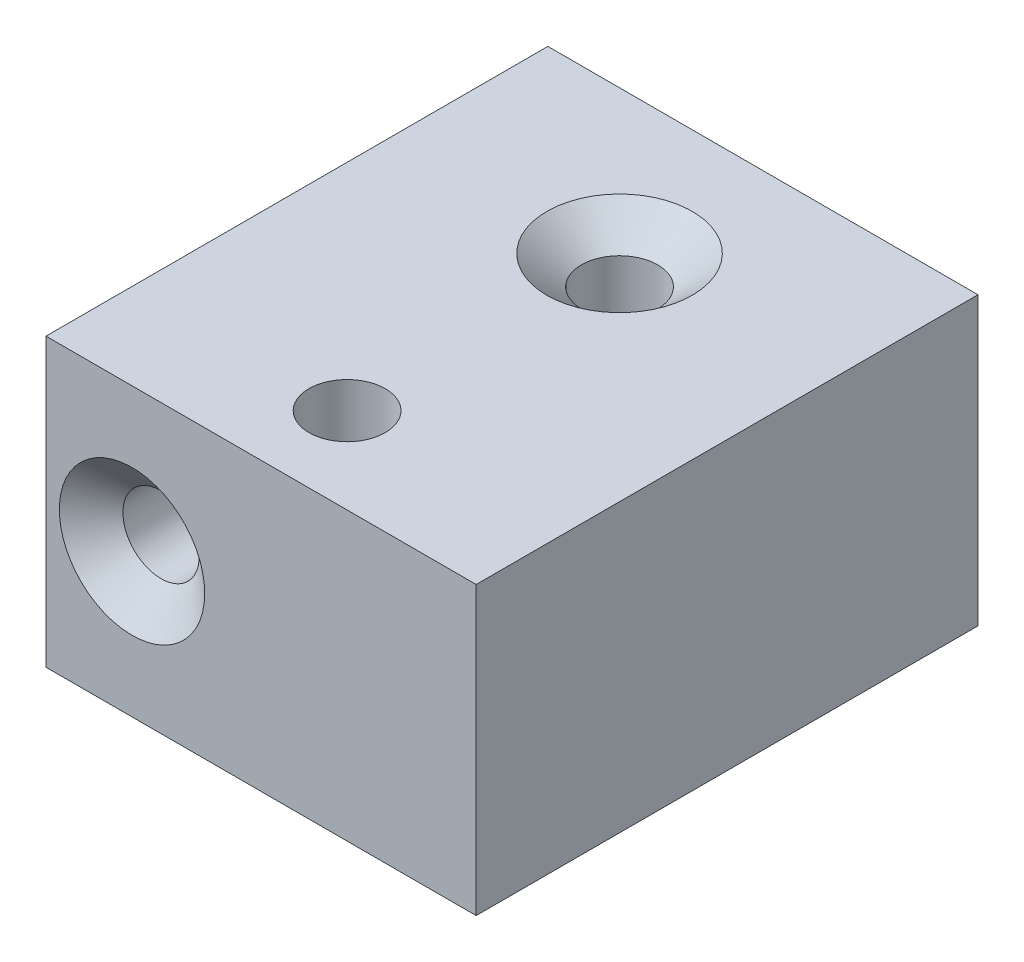
ISO-10303-21;
HEADER;
FILE_DESCRIPTION(('STEP AP214'),'2;1');
FILE_NAME('part.step','',(''),(''),'','','');
FILE_SCHEMA(('AUTOMOTIVE_DESIGN { 1 0 10303 214 1 1 1 1 }'));
ENDSEC;
DATA;
#1=APPLICATION_CONTEXT('core data for automotive mechanical design processes');
#2=APPLICATION_PROTOCOL_DEFINITION('international standard','automotive_design',2000,#1);
#3=PRODUCT_CONTEXT('',#1,'mechanical');
#4=PRODUCT('Part','Part','',(#3));
#5=PRODUCT_RELATED_PRODUCT_CATEGORY('part','',(#4));
#6=PRODUCT_DEFINITION_FORMATION('','',#4);
#7=PRODUCT_DEFINITION_CONTEXT('part definition',#1,'design');
#8=PRODUCT_DEFINITION('design','',#6,#7);
#9=PRODUCT_DEFINITION_SHAPE('','',#8);
#10=(LENGTH_UNIT() NAMED_UNIT(*) SI_UNIT(.MILLI.,.METRE.));
#11=(NAMED_UNIT(*) PLANE_ANGLE_UNIT() SI_UNIT($,.RADIAN.));
#12=(NAMED_UNIT(*) SI_UNIT($,.STERADIAN.) SOLID_ANGLE_UNIT());
#13=UNCERTAINTY_MEASURE_WITH_UNIT(LENGTH_MEASURE(1.E-05),#10,'distance_accuracy_value','');
#14=(GEOMETRIC_REPRESENTATION_CONTEXT(3) GLOBAL_UNCERTAINTY_ASSIGNED_CONTEXT((#13)) GLOBAL_UNIT_ASSIGNED_CONTEXT((#10,
#11,#12)) REPRESENTATION_CONTEXT('',''));
#15=CARTESIAN_POINT('',(0.,0.,0.));
#16=DIRECTION('',(0.,0.,1.));
#17=DIRECTION('',(1.,0.,0.));
#18=AXIS2_PLACEMENT_3D('',#15,#16,#17);
#19=CARTESIAN_POINT('',(19.05,25.4,22.225));
#20=DIRECTION('',(-1.,0.,0.));
#21=DIRECTION('',(0.,0.,1.));
#22=AXIS2_PLACEMENT_3D('',#19,#20,#21);
#23=PLANE('',#22);
#24=DIRECTION('',(0.,0.,-1.));
#25=VECTOR('',#24,1.);
#26=CARTESIAN_POINT('',(19.05,0.,22.225));
#27=LINE('',#26,#25);
#28=CARTESIAN_POINT('',(19.05,0.,22.225));
#29=VERTEX_POINT('',#28);
#30=CARTESIAN_POINT('',(19.05,0.,-22.225));
#31=VERTEX_POINT('',#30);
#32=EDGE_CURVE('E112',#29,#31,#27,.T.);
#33=ORIENTED_EDGE('',*,*,#32,.T.);
#34=DIRECTION('',(0.,-1.,0.));
#35=VECTOR('',#34,1.);
#36=CARTESIAN_POINT('',(19.05,25.4,-22.225));
#37=LINE('',#36,#35);
#38=CARTESIAN_POINT('',(19.05,25.4,-22.225));
#39=VERTEX_POINT('',#38);
#40=EDGE_CURVE('E11',#39,#31,#37,.T.);
#41=ORIENTED_EDGE('',*,*,#40,.F.);
#42=DIRECTION('',(0.,0.,-1.));
#43=VECTOR('',#42,1.);
#44=CARTESIAN_POINT('',(19.05,25.4,22.225));
#45=LINE('',#44,#43);
#46=CARTESIAN_POINT('',(19.05,25.4,22.225));
#47=VERTEX_POINT('',#46);
#48=EDGE_CURVE('E95',#47,#39,#45,.T.);
#49=ORIENTED_EDGE('',*,*,#48,.F.);
#50=DIRECTION('',(0.,-1.,0.));
#51=VECTOR('',#50,1.);
#52=CARTESIAN_POINT('',(19.05,25.4,22.225));
#53=LINE('',#52,#51);
#54=EDGE_CURVE('E108',#47,#29,#53,.T.);
#55=ORIENTED_EDGE('',*,*,#54,.T.);
#56=EDGE_LOOP('',(#33,#41,#49,#55));
#57=FACE_BOUND('',#56,.T.);
#58=ADVANCED_FACE('F43',(#57),#23,.F.);
#59=CARTESIAN_POINT('',(-19.05,25.4,-22.225));
#60=DIRECTION('',(0.,0.,1.));
#61=DIRECTION('',(1.,0.,0.));
#62=AXIS2_PLACEMENT_3D('',#59,#60,#61);
#63=PLANE('',#62);
#64=CARTESIAN_POINT('',(-11.43,12.7,-22.225));
#65=DIRECTION('',(0.,0.,1.));
#66=DIRECTION('',(1.,0.,0.));
#67=AXIS2_PLACEMENT_3D('',#64,#65,#66);
#68=CIRCLE('',#67,3.37819999999999);
#69=CARTESIAN_POINT('',(-8.05180000000001,12.7,-22.225));
#70=VERTEX_POINT('',#69);
#71=EDGE_CURVE('E156',#70,#70,#68,.T.);
#72=ORIENTED_EDGE('',*,*,#71,.T.);
#73=EDGE_LOOP('',(#72));
#74=FACE_BOUND('',#73,.T.);
#75=DIRECTION('',(-1.,0.,0.));
#76=VECTOR('',#75,1.);
#77=CARTESIAN_POINT('',(-19.05,0.,-22.225));
#78=LINE('',#77,#76);
#79=CARTESIAN_POINT('',(-19.05,0.,-22.225));
#80=VERTEX_POINT('',#79);
#81=EDGE_CURVE('E100',#31,#80,#78,.T.);
#82=ORIENTED_EDGE('',*,*,#81,.T.);
#83=DIRECTION('',(0.,-1.,0.));
#84=VECTOR('',#83,1.);
#85=CARTESIAN_POINT('',(-19.05,25.4,-22.225));
#86=LINE('',#85,#84);
#87=CARTESIAN_POINT('',(-19.05,25.4,-22.225));
#88=VERTEX_POINT('',#87);
#89=EDGE_CURVE('E52',#88,#80,#86,.T.);
#90=ORIENTED_EDGE('',*,*,#89,.F.);
#91=DIRECTION('',(-1.,0.,0.));
#92=VECTOR('',#91,1.);
#93=CARTESIAN_POINT('',(-19.05,25.4,-22.225));
#94=LINE('',#93,#92);
#95=EDGE_CURVE('E90',#39,#88,#94,.T.);
#96=ORIENTED_EDGE('',*,*,#95,.F.);
#97=ORIENTED_EDGE('',*,*,#40,.T.);
#98=EDGE_LOOP('',(#82,#90,#96,#97));
#99=FACE_BOUND('',#98,.T.);
#100=ADVANCED_FACE('F99',(#74,#99),#63,.F.);
#101=CARTESIAN_POINT('',(-19.05,25.4,22.225));
#102=DIRECTION('',(1.,0.,0.));
#103=DIRECTION('',(0.,0.,-1.));
#104=AXIS2_PLACEMENT_3D('',#101,#102,#103);
#105=PLANE('',#104);
#106=DIRECTION('',(0.,0.,1.));
#107=VECTOR('',#106,1.);
#108=CARTESIAN_POINT('',(-19.05,0.,22.225));
#109=LINE('',#108,#107);
#110=CARTESIAN_POINT('',(-19.05,0.,22.225));
#111=VERTEX_POINT('',#110);
#112=EDGE_CURVE('E77',#80,#111,#109,.T.);
#113=ORIENTED_EDGE('',*,*,#112,.T.);
#114=DIRECTION('',(0.,-1.,0.));
#115=VECTOR('',#114,1.);
#116=CARTESIAN_POINT('',(-19.05,25.4,22.225));
#117=LINE('',#116,#115);
#118=CARTESIAN_POINT('',(-19.05,25.4,22.225));
#119=VERTEX_POINT('',#118);
#120=EDGE_CURVE('E102',#119,#111,#117,.T.);
#121=ORIENTED_EDGE('',*,*,#120,.F.);
#122=DIRECTION('',(0.,0.,1.));
#123=VECTOR('',#122,1.);
#124=CARTESIAN_POINT('',(-19.05,25.4,22.225));
#125=LINE('',#124,#123);
#126=EDGE_CURVE('E93',#88,#119,#125,.T.);
#127=ORIENTED_EDGE('',*,*,#126,.F.);
#128=ORIENTED_EDGE('',*,*,#89,.T.);
#129=EDGE_LOOP('',(#113,#121,#127,#128));
#130=FACE_BOUND('',#129,.T.);
#131=ADVANCED_FACE('F103',(#130),#105,.F.);
#132=CARTESIAN_POINT('',(-19.05,25.4,22.225));
#133=DIRECTION('',(0.,0.,-1.));
#134=DIRECTION('',(-1.,0.,0.));
#135=AXIS2_PLACEMENT_3D('',#132,#133,#134);
#136=PLANE('',#135);
#137=CARTESIAN_POINT('',(-11.43,12.7,22.225));
#138=DIRECTION('',(0.,0.,1.));
#139=DIRECTION('',(1.,0.,0.));
#140=AXIS2_PLACEMENT_3D('',#137,#138,#139);
#141=CIRCLE('',#140,6.4389);
#142=CARTESIAN_POINT('',(-4.9911,12.7,22.225));
#143=VERTEX_POINT('',#142);
#144=EDGE_CURVE('E163',#143,#143,#141,.T.);
#145=ORIENTED_EDGE('',*,*,#144,.F.);
#146=EDGE_LOOP('',(#145));
#147=FACE_BOUND('',#146,.T.);
#148=DIRECTION('',(1.,0.,0.));
#149=VECTOR('',#148,1.);
#150=CARTESIAN_POINT('',(-19.05,0.,22.225));
#151=LINE('',#150,#149);
#152=EDGE_CURVE('E83',#111,#29,#151,.T.);
#153=ORIENTED_EDGE('',*,*,#152,.T.);
#154=ORIENTED_EDGE('',*,*,#54,.F.);
#155=DIRECTION('',(1.,0.,0.));
#156=VECTOR('',#155,1.);
#157=CARTESIAN_POINT('',(-19.05,25.4,22.225));
#158=LINE('',#157,#156);
#159=EDGE_CURVE('E60',#119,#47,#158,.T.);
#160=ORIENTED_EDGE('',*,*,#159,.F.);
#161=ORIENTED_EDGE('',*,*,#120,.T.);
#162=EDGE_LOOP('',(#153,#154,#160,#161));
#163=FACE_BOUND('',#162,.T.);
#164=ADVANCED_FACE('F127',(#147,#163),#136,.F.);
#165=CARTESIAN_POINT('',(0.,25.4,0.));
#166=DIRECTION('',(0.,-1.,0.));
#167=DIRECTION('',(0.,0.,-1.));
#168=AXIS2_PLACEMENT_3D('',#165,#166,#167);
#169=PLANE('',#168);
#170=CARTESIAN_POINT('',(0.,25.4,14.605));
#171=DIRECTION('',(0.,-1.,0.));
#172=DIRECTION('',(0.,0.,-1.));
#173=AXIS2_PLACEMENT_3D('',#170,#171,#172);
#174=CIRCLE('',#173,3.3782);
#175=CARTESIAN_POINT('',(0.,25.4,11.2268));
#176=VERTEX_POINT('',#175);
#177=EDGE_CURVE('E145',#176,#176,#174,.T.);
#178=ORIENTED_EDGE('',*,*,#177,.T.);
#179=EDGE_LOOP('',(#178));
#180=FACE_BOUND('',#179,.T.);
#181=CARTESIAN_POINT('',(0.,25.4,-9.525));
#182=DIRECTION('',(0.,1.,0.));
#183=DIRECTION('',(0.,0.,1.));
#184=AXIS2_PLACEMENT_3D('',#181,#182,#183);
#185=CIRCLE('',#184,6.4389);
#186=CARTESIAN_POINT('',(0.,25.4,-3.0861));
#187=VERTEX_POINT('',#186);
#188=EDGE_CURVE('E141',#187,#187,#185,.T.);
#189=ORIENTED_EDGE('',*,*,#188,.F.);
#190=EDGE_LOOP('',(#189));
#191=FACE_BOUND('',#190,.T.);
#192=ORIENTED_EDGE('',*,*,#48,.T.);
#193=ORIENTED_EDGE('',*,*,#95,.T.);
#194=ORIENTED_EDGE('',*,*,#126,.T.);
#195=ORIENTED_EDGE('',*,*,#159,.T.);
#196=EDGE_LOOP('',(#192,#193,#194,#195));
#197=FACE_BOUND('',#196,.T.);
#198=ADVANCED_FACE('F91',(#180,#191,#197),#169,.F.);
#199=CARTESIAN_POINT('',(0.,0.,0.));
#200=DIRECTION('',(0.,-1.,0.));
#201=DIRECTION('',(0.,0.,-1.));
#202=AXIS2_PLACEMENT_3D('',#199,#200,#201);
#203=PLANE('',#202);
#204=CARTESIAN_POINT('',(0.,0.,14.605));
#205=DIRECTION('',(0.,-1.,0.));
#206=DIRECTION('',(0.,0.,-1.));
#207=AXIS2_PLACEMENT_3D('',#204,#205,#206);
#208=CIRCLE('',#207,6.4389);
#209=CARTESIAN_POINT('',(0.,0.,8.1661));
#210=VERTEX_POINT('',#209);
#211=EDGE_CURVE('E152',#210,#210,#208,.T.);
#212=ORIENTED_EDGE('',*,*,#211,.F.);
#213=EDGE_LOOP('',(#212));
#214=FACE_BOUND('',#213,.T.);
#215=CARTESIAN_POINT('',(0.,0.,-9.525));
#216=DIRECTION('',(0.,1.,0.));
#217=DIRECTION('',(0.,0.,1.));
#218=AXIS2_PLACEMENT_3D('',#215,#216,#217);
#219=CIRCLE('',#218,3.3782);
#220=CARTESIAN_POINT('',(0.,0.,-6.14680000000001));
#221=VERTEX_POINT('',#220);
#222=EDGE_CURVE('E116',#221,#221,#219,.T.);
#223=ORIENTED_EDGE('',*,*,#222,.T.);
#224=EDGE_LOOP('',(#223));
#225=FACE_BOUND('',#224,.T.);
#226=ORIENTED_EDGE('',*,*,#32,.F.);
#227=ORIENTED_EDGE('',*,*,#152,.F.);
#228=ORIENTED_EDGE('',*,*,#112,.F.);
#229=ORIENTED_EDGE('',*,*,#81,.F.);
#230=EDGE_LOOP('',(#226,#227,#228,#229));
#231=FACE_BOUND('',#230,.T.);
#232=ADVANCED_FACE('F130',(#214,#225,#231),#203,.T.);
#233=CARTESIAN_POINT('',(0.,25.4,-9.525));
#234=DIRECTION('',(0.,1.,0.));
#235=DIRECTION('',(0.,0.,1.));
#236=AXIS2_PLACEMENT_3D('',#233,#234,#235);
#237=CYLINDRICAL_SURFACE('',#236,3.3782);
#238=ORIENTED_EDGE('',*,*,#222,.F.);
#239=EDGE_LOOP('',(#238));
#240=FACE_BOUND('',#239,.T.);
#241=CARTESIAN_POINT('',(0.,22.8317677588557,-9.525));
#242=DIRECTION('',(0.,1.,0.));
#243=DIRECTION('',(0.,0.,1.));
#244=AXIS2_PLACEMENT_3D('',#241,#242,#243);
#245=CIRCLE('',#244,3.3782);
#246=CARTESIAN_POINT('',(0.,22.8317677588557,-6.1468));
#247=VERTEX_POINT('',#246);
#248=EDGE_CURVE('E137',#247,#247,#245,.T.);
#249=ORIENTED_EDGE('',*,*,#248,.T.);
#250=EDGE_LOOP('',(#249));
#251=FACE_BOUND('',#250,.T.);
#252=ADVANCED_FACE('F207',(#240,#251),#237,.F.);
#253=CARTESIAN_POINT('',(0.,25.4,-9.525));
#254=DIRECTION('',(0.,1.,0.));
#255=DIRECTION('',(0.,0.,1.));
#256=AXIS2_PLACEMENT_3D('',#253,#254,#255);
#257=CONICAL_SURFACE('',#256,6.4389,0.872664625997165);
#258=ORIENTED_EDGE('',*,*,#248,.F.);
#259=EDGE_LOOP('',(#258));
#260=FACE_BOUND('',#259,.T.);
#261=ORIENTED_EDGE('',*,*,#188,.T.);
#262=EDGE_LOOP('',(#261));
#263=FACE_BOUND('',#262,.T.);
#264=ADVANCED_FACE('F203',(#260,#263),#257,.F.);
#265=CARTESIAN_POINT('',(0.,0.,14.605));
#266=DIRECTION('',(0.,-1.,0.));
#267=DIRECTION('',(0.,0.,-1.));
#268=AXIS2_PLACEMENT_3D('',#265,#266,#267);
#269=CYLINDRICAL_SURFACE('',#268,3.37819999999999);
#270=ORIENTED_EDGE('',*,*,#177,.F.);
#271=EDGE_LOOP('',(#270));
#272=FACE_BOUND('',#271,.T.);
#273=CARTESIAN_POINT('',(0.,2.56823224114432,14.605));
#274=DIRECTION('',(0.,-1.,0.));
#275=DIRECTION('',(0.,0.,-1.));
#276=AXIS2_PLACEMENT_3D('',#273,#274,#275);
#277=CIRCLE('',#276,3.37819999999999);
#278=CARTESIAN_POINT('',(0.,2.56823224114432,11.2268));
#279=VERTEX_POINT('',#278);
#280=EDGE_CURVE('E149',#279,#279,#277,.T.);
#281=ORIENTED_EDGE('',*,*,#280,.T.);
#282=EDGE_LOOP('',(#281));
#283=FACE_BOUND('',#282,.T.);
#284=ADVANCED_FACE('F199',(#272,#283),#269,.F.);
#285=CARTESIAN_POINT('',(0.,0.,14.605));
#286=DIRECTION('',(0.,-1.,0.));
#287=DIRECTION('',(0.,0.,-1.));
#288=AXIS2_PLACEMENT_3D('',#285,#286,#287);
#289=CONICAL_SURFACE('',#288,6.4389,0.872664625997164);
#290=ORIENTED_EDGE('',*,*,#280,.F.);
#291=EDGE_LOOP('',(#290));
#292=FACE_BOUND('',#291,.T.);
#293=ORIENTED_EDGE('',*,*,#211,.T.);
#294=EDGE_LOOP('',(#293));
#295=FACE_BOUND('',#294,.T.);
#296=ADVANCED_FACE('F189',(#292,#295),#289,.F.);
#297=CARTESIAN_POINT('',(-11.43,12.7,22.225));
#298=DIRECTION('',(0.,0.,1.));
#299=DIRECTION('',(1.,0.,0.));
#300=AXIS2_PLACEMENT_3D('',#297,#298,#299);
#301=CYLINDRICAL_SURFACE('',#300,3.37819999999999);
#302=ORIENTED_EDGE('',*,*,#71,.F.);
#303=EDGE_LOOP('',(#302));
#304=FACE_BOUND('',#303,.T.);
#305=CARTESIAN_POINT('',(-11.43,12.7,19.6567677588557));
#306=DIRECTION('',(0.,0.,1.));
#307=DIRECTION('',(1.,0.,0.));
#308=AXIS2_PLACEMENT_3D('',#305,#306,#307);
#309=CIRCLE('',#308,3.37819999999999);
#310=CARTESIAN_POINT('',(-8.05180000000001,12.7,19.6567677588557));
#311=VERTEX_POINT('',#310);
#312=EDGE_CURVE('E160',#311,#311,#309,.T.);
#313=ORIENTED_EDGE('',*,*,#312,.T.);
#314=EDGE_LOOP('',(#313));
#315=FACE_BOUND('',#314,.T.);
#316=ADVANCED_FACE('F186',(#304,#315),#301,.F.);
#317=CARTESIAN_POINT('',(-11.43,12.7,22.225));
#318=DIRECTION('',(0.,0.,1.));
#319=DIRECTION('',(1.,0.,0.));
#320=AXIS2_PLACEMENT_3D('',#317,#318,#319);
#321=CONICAL_SURFACE('',#320,6.4389,0.872664625997164);
#322=ORIENTED_EDGE('',*,*,#312,.F.);
#323=EDGE_LOOP('',(#322));
#324=FACE_BOUND('',#323,.T.);
#325=ORIENTED_EDGE('',*,*,#144,.T.);
#326=EDGE_LOOP('',(#325));
#327=FACE_BOUND('',#326,.T.);
#328=ADVANCED_FACE('F168',(#324,#327),#321,.F.);
#329=CLOSED_SHELL('',(#58,#100,#131,#164,#198,#232,#252,#264,#284,#296,#316,#328));
#330=MANIFOLD_SOLID_BREP('B2',#329);
#331=ADVANCED_BREP_SHAPE_REPRESENTATION('',(#18,#330),#14);
#332=SHAPE_DEFINITION_REPRESENTATION(#9,#331);
ENDSEC;
END-ISO-10303-21;
